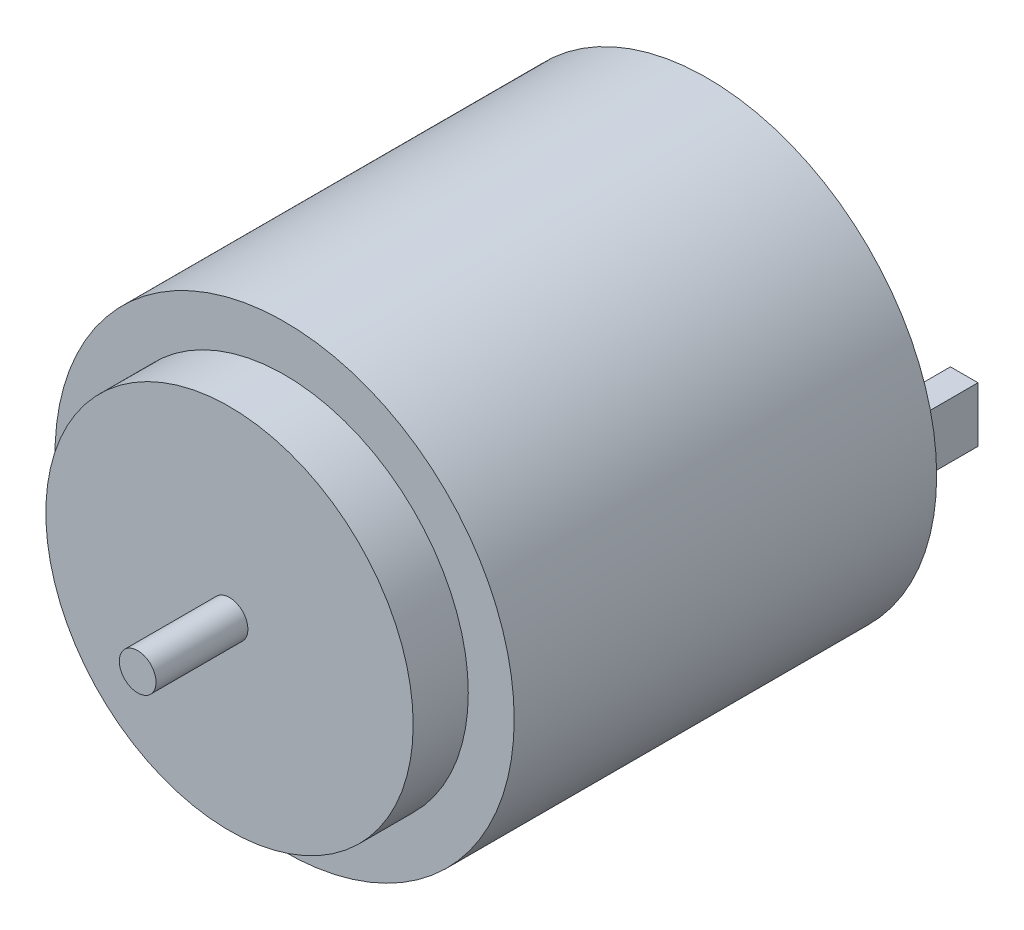
ISO-10303-21;
HEADER;
FILE_DESCRIPTION(('STEP AP214'),'2;1');
FILE_NAME('part.step','',(''),(''),'','','');
FILE_SCHEMA(('AUTOMOTIVE_DESIGN { 1 0 10303 214 1 1 1 1 }'));
ENDSEC;
DATA;
#1=APPLICATION_CONTEXT('core data for automotive mechanical design processes');
#2=APPLICATION_PROTOCOL_DEFINITION('international standard','automotive_design',2000,#1);
#3=PRODUCT_CONTEXT('',#1,'mechanical');
#4=PRODUCT('Part','Part','',(#3));
#5=PRODUCT_RELATED_PRODUCT_CATEGORY('part','',(#4));
#6=PRODUCT_DEFINITION_FORMATION('','',#4);
#7=PRODUCT_DEFINITION_CONTEXT('part definition',#1,'design');
#8=PRODUCT_DEFINITION('design','',#6,#7);
#9=PRODUCT_DEFINITION_SHAPE('','',#8);
#10=(LENGTH_UNIT() NAMED_UNIT(*) SI_UNIT(.MILLI.,.METRE.));
#11=(NAMED_UNIT(*) PLANE_ANGLE_UNIT() SI_UNIT($,.RADIAN.));
#12=(NAMED_UNIT(*) SI_UNIT($,.STERADIAN.) SOLID_ANGLE_UNIT());
#13=UNCERTAINTY_MEASURE_WITH_UNIT(LENGTH_MEASURE(1.E-05),#10,'distance_accuracy_value','');
#14=(GEOMETRIC_REPRESENTATION_CONTEXT(3) GLOBAL_UNCERTAINTY_ASSIGNED_CONTEXT((#13)) GLOBAL_UNIT_ASSIGNED_CONTEXT((#10,
#11,#12)) REPRESENTATION_CONTEXT('',''));
#15=CARTESIAN_POINT('',(0.,0.,0.));
#16=DIRECTION('',(0.,0.,1.));
#17=DIRECTION('',(1.,0.,0.));
#18=AXIS2_PLACEMENT_3D('',#15,#16,#17);
#19=CARTESIAN_POINT('',(-60.7801317233809,28.5357142857143,0.));
#20=DIRECTION('',(0.,0.,1.));
#21=DIRECTION('',(1.,0.,0.));
#22=AXIS2_PLACEMENT_3D('',#19,#20,#21);
#23=PLANE('',#22);
#24=DIRECTION('',(0.,1.,0.));
#25=VECTOR('',#24,1.);
#26=CARTESIAN_POINT('',(-51.5301317233809,27.0357142857143,0.));
#27=LINE('',#26,#25);
#28=CARTESIAN_POINT('',(-51.5301317233809,27.0357142857143,0.));
#29=VERTEX_POINT('',#28);
#30=CARTESIAN_POINT('',(-51.5301317233809,30.0357142857143,0.));
#31=VERTEX_POINT('',#30);
#32=EDGE_CURVE('E122',#29,#31,#27,.T.);
#33=ORIENTED_EDGE('',*,*,#32,.F.);
#34=DIRECTION('',(-1.,0.,0.));
#35=VECTOR('',#34,1.);
#36=CARTESIAN_POINT('',(-50.0301317233809,27.0357142857143,0.));
#37=LINE('',#36,#35);
#38=CARTESIAN_POINT('',(-50.0301317233809,27.0357142857143,0.));
#39=VERTEX_POINT('',#38);
#40=EDGE_CURVE('E135',#39,#29,#37,.T.);
#41=ORIENTED_EDGE('',*,*,#40,.F.);
#42=DIRECTION('',(0.,-1.,0.));
#43=VECTOR('',#42,1.);
#44=CARTESIAN_POINT('',(-50.0301317233809,27.0357142857143,0.));
#45=LINE('',#44,#43);
#46=CARTESIAN_POINT('',(-50.0301317233809,30.0357142857143,0.));
#47=VERTEX_POINT('',#46);
#48=EDGE_CURVE('E144',#47,#39,#45,.T.);
#49=ORIENTED_EDGE('',*,*,#48,.F.);
#50=DIRECTION('',(1.,0.,0.));
#51=VECTOR('',#50,1.);
#52=CARTESIAN_POINT('',(-50.0301317233809,30.0357142857143,0.));
#53=LINE('',#52,#51);
#54=EDGE_CURVE('E125',#31,#47,#53,.T.);
#55=ORIENTED_EDGE('',*,*,#54,.F.);
#56=EDGE_LOOP('',(#33,#41,#49,#55));
#57=FACE_BOUND('',#56,.T.);
#58=CARTESIAN_POINT('',(-60.7801317233809,28.5357142857143,0.));
#59=DIRECTION('',(0.,0.,1.));
#60=DIRECTION('',(1.,0.,0.));
#61=AXIS2_PLACEMENT_3D('',#58,#59,#60);
#62=CIRCLE('',#61,12.5);
#63=CARTESIAN_POINT('',(-48.2801317233809,28.5357142857143,0.));
#64=VERTEX_POINT('',#63);
#65=EDGE_CURVE('E38',#64,#64,#62,.T.);
#66=ORIENTED_EDGE('',*,*,#65,.F.);
#67=EDGE_LOOP('',(#66));
#68=FACE_BOUND('',#67,.T.);
#69=DIRECTION('',(-1.,0.,0.));
#70=VECTOR('',#69,1.);
#71=CARTESIAN_POINT('',(-71.5301317233809,27.0357142857143,0.));
#72=LINE('',#71,#70);
#73=CARTESIAN_POINT('',(-70.0301317233809,27.0357142857143,0.));
#74=VERTEX_POINT('',#73);
#75=CARTESIAN_POINT('',(-71.5301317233809,27.0357142857143,0.));
#76=VERTEX_POINT('',#75);
#77=EDGE_CURVE('E121',#74,#76,#72,.T.);
#78=ORIENTED_EDGE('',*,*,#77,.F.);
#79=DIRECTION('',(0.,-1.,0.));
#80=VECTOR('',#79,1.);
#81=CARTESIAN_POINT('',(-70.0301317233809,27.0357142857143,0.));
#82=LINE('',#81,#80);
#83=CARTESIAN_POINT('',(-70.0301317233809,30.0357142857143,0.));
#84=VERTEX_POINT('',#83);
#85=EDGE_CURVE('E118',#84,#74,#82,.T.);
#86=ORIENTED_EDGE('',*,*,#85,.F.);
#87=DIRECTION('',(1.,0.,0.));
#88=VECTOR('',#87,1.);
#89=CARTESIAN_POINT('',(-71.5301317233809,30.0357142857143,0.));
#90=LINE('',#89,#88);
#91=CARTESIAN_POINT('',(-71.5301317233809,30.0357142857143,0.));
#92=VERTEX_POINT('',#91);
#93=EDGE_CURVE('E56',#92,#84,#90,.T.);
#94=ORIENTED_EDGE('',*,*,#93,.F.);
#95=DIRECTION('',(0.,1.,0.));
#96=VECTOR('',#95,1.);
#97=CARTESIAN_POINT('',(-71.5301317233809,27.0357142857143,0.));
#98=LINE('',#97,#96);
#99=EDGE_CURVE('E51',#76,#92,#98,.T.);
#100=ORIENTED_EDGE('',*,*,#99,.F.);
#101=EDGE_LOOP('',(#78,#86,#94,#100));
#102=FACE_BOUND('',#101,.T.);
#103=ADVANCED_FACE('F34',(#57,#68,#102),#23,.F.);
#104=CARTESIAN_POINT('',(-60.7801317233809,28.5357142857143,23.));
#105=DIRECTION('',(0.,0.,-1.));
#106=DIRECTION('',(-1.,0.,0.));
#107=AXIS2_PLACEMENT_3D('',#104,#105,#106);
#108=CYLINDRICAL_SURFACE('',#107,12.5);
#109=CARTESIAN_POINT('',(-60.7801317233809,28.5357142857143,23.));
#110=DIRECTION('',(0.,0.,1.));
#111=DIRECTION('',(1.,0.,0.));
#112=AXIS2_PLACEMENT_3D('',#109,#110,#111);
#113=CIRCLE('',#112,12.5);
#114=CARTESIAN_POINT('',(-48.2801317233809,28.5357142857143,23.));
#115=VERTEX_POINT('',#114);
#116=EDGE_CURVE('E43',#115,#115,#113,.T.);
#117=ORIENTED_EDGE('',*,*,#116,.F.);
#118=EDGE_LOOP('',(#117));
#119=FACE_BOUND('',#118,.T.);
#120=ORIENTED_EDGE('',*,*,#65,.T.);
#121=EDGE_LOOP('',(#120));
#122=FACE_BOUND('',#121,.T.);
#123=ADVANCED_FACE('F36',(#119,#122),#108,.T.);
#124=CARTESIAN_POINT('',(-60.7801317233809,28.5357142857143,23.));
#125=DIRECTION('',(0.,0.,1.));
#126=DIRECTION('',(1.,0.,0.));
#127=AXIS2_PLACEMENT_3D('',#124,#125,#126);
#128=PLANE('',#127);
#129=CARTESIAN_POINT('',(-60.7801317233809,28.5357142857143,23.));
#130=DIRECTION('',(0.,0.,1.));
#131=DIRECTION('',(1.,0.,0.));
#132=AXIS2_PLACEMENT_3D('',#129,#130,#131);
#133=CIRCLE('',#132,10.);
#134=CARTESIAN_POINT('',(-50.7801317233809,28.5357142857143,23.));
#135=VERTEX_POINT('',#134);
#136=EDGE_CURVE('E11',#135,#135,#133,.T.);
#137=ORIENTED_EDGE('',*,*,#136,.F.);
#138=EDGE_LOOP('',(#137));
#139=FACE_BOUND('',#138,.T.);
#140=ORIENTED_EDGE('',*,*,#116,.T.);
#141=EDGE_LOOP('',(#140));
#142=FACE_BOUND('',#141,.T.);
#143=ADVANCED_FACE('F239',(#139,#142),#128,.T.);
#144=CARTESIAN_POINT('',(-60.7801317233809,28.5357142857143,26.));
#145=DIRECTION('',(0.,0.,-1.));
#146=DIRECTION('',(-1.,0.,0.));
#147=AXIS2_PLACEMENT_3D('',#144,#145,#146);
#148=CYLINDRICAL_SURFACE('',#147,10.);
#149=CARTESIAN_POINT('',(-60.7801317233809,28.5357142857143,26.));
#150=DIRECTION('',(0.,0.,1.));
#151=DIRECTION('',(1.,0.,0.));
#152=AXIS2_PLACEMENT_3D('',#149,#150,#151);
#153=CIRCLE('',#152,10.);
#154=CARTESIAN_POINT('',(-50.7801317233809,28.5357142857143,26.));
#155=VERTEX_POINT('',#154);
#156=EDGE_CURVE('E164',#155,#155,#153,.T.);
#157=ORIENTED_EDGE('',*,*,#156,.F.);
#158=EDGE_LOOP('',(#157));
#159=FACE_BOUND('',#158,.T.);
#160=ORIENTED_EDGE('',*,*,#136,.T.);
#161=EDGE_LOOP('',(#160));
#162=FACE_BOUND('',#161,.T.);
#163=ADVANCED_FACE('F235',(#159,#162),#148,.T.);
#164=CARTESIAN_POINT('',(-60.7801317233809,28.5357142857143,26.));
#165=DIRECTION('',(0.,0.,1.));
#166=DIRECTION('',(1.,0.,0.));
#167=AXIS2_PLACEMENT_3D('',#164,#165,#166);
#168=PLANE('',#167);
#169=CARTESIAN_POINT('',(-60.7801317233809,28.5357142857143,26.));
#170=DIRECTION('',(0.,0.,1.));
#171=DIRECTION('',(1.,0.,0.));
#172=AXIS2_PLACEMENT_3D('',#169,#170,#171);
#173=CIRCLE('',#172,0.999999999999998);
#174=CARTESIAN_POINT('',(-59.7801317233809,28.5357142857143,26.));
#175=VERTEX_POINT('',#174);
#176=EDGE_CURVE('E160',#175,#175,#173,.T.);
#177=ORIENTED_EDGE('',*,*,#176,.F.);
#178=EDGE_LOOP('',(#177));
#179=FACE_BOUND('',#178,.T.);
#180=ORIENTED_EDGE('',*,*,#156,.T.);
#181=EDGE_LOOP('',(#180));
#182=FACE_BOUND('',#181,.T.);
#183=ADVANCED_FACE('F231',(#179,#182),#168,.T.);
#184=CARTESIAN_POINT('',(-60.7801317233809,28.5357142857143,31.));
#185=DIRECTION('',(0.,0.,-1.));
#186=DIRECTION('',(-1.,0.,0.));
#187=AXIS2_PLACEMENT_3D('',#184,#185,#186);
#188=CYLINDRICAL_SURFACE('',#187,0.999999999999998);
#189=CARTESIAN_POINT('',(-60.7801317233809,28.5357142857143,31.));
#190=DIRECTION('',(0.,0.,1.));
#191=DIRECTION('',(1.,0.,0.));
#192=AXIS2_PLACEMENT_3D('',#189,#190,#191);
#193=CIRCLE('',#192,0.999999999999998);
#194=CARTESIAN_POINT('',(-59.7801317233809,28.5357142857143,31.));
#195=VERTEX_POINT('',#194);
#196=EDGE_CURVE('E161',#195,#195,#193,.T.);
#197=ORIENTED_EDGE('',*,*,#196,.F.);
#198=EDGE_LOOP('',(#197));
#199=FACE_BOUND('',#198,.T.);
#200=ORIENTED_EDGE('',*,*,#176,.T.);
#201=EDGE_LOOP('',(#200));
#202=FACE_BOUND('',#201,.T.);
#203=ADVANCED_FACE('F227',(#199,#202),#188,.T.);
#204=CARTESIAN_POINT('',(-60.7801317233809,28.5357142857143,31.));
#205=DIRECTION('',(0.,0.,1.));
#206=DIRECTION('',(1.,0.,0.));
#207=AXIS2_PLACEMENT_3D('',#204,#205,#206);
#208=PLANE('',#207);
#209=ORIENTED_EDGE('',*,*,#196,.T.);
#210=EDGE_LOOP('',(#209));
#211=FACE_BOUND('',#210,.T.);
#212=ADVANCED_FACE('F223',(#211),#208,.T.);
#213=CARTESIAN_POINT('',(-51.5301317233809,27.0357142857143,-4.));
#214=DIRECTION('',(1.,0.,0.));
#215=DIRECTION('',(0.,0.,-1.));
#216=AXIS2_PLACEMENT_3D('',#213,#214,#215);
#217=PLANE('',#216);
#218=ORIENTED_EDGE('',*,*,#32,.T.);
#219=DIRECTION('',(0.,0.,1.));
#220=VECTOR('',#219,1.);
#221=CARTESIAN_POINT('',(-51.5301317233809,30.0357142857143,-4.));
#222=LINE('',#221,#220);
#223=CARTESIAN_POINT('',(-51.5301317233809,30.0357142857143,-4.));
#224=VERTEX_POINT('',#223);
#225=EDGE_CURVE('E157',#224,#31,#222,.T.);
#226=ORIENTED_EDGE('',*,*,#225,.F.);
#227=DIRECTION('',(0.,1.,0.));
#228=VECTOR('',#227,1.);
#229=CARTESIAN_POINT('',(-51.5301317233809,27.0357142857143,-4.));
#230=LINE('',#229,#228);
#231=CARTESIAN_POINT('',(-51.5301317233809,27.0357142857143,-4.));
#232=VERTEX_POINT('',#231);
#233=EDGE_CURVE('E131',#232,#224,#230,.T.);
#234=ORIENTED_EDGE('',*,*,#233,.F.);
#235=DIRECTION('',(0.,0.,1.));
#236=VECTOR('',#235,1.);
#237=CARTESIAN_POINT('',(-51.5301317233809,27.0357142857143,-4.));
#238=LINE('',#237,#236);
#239=EDGE_CURVE('E140',#232,#29,#238,.T.);
#240=ORIENTED_EDGE('',*,*,#239,.T.);
#241=EDGE_LOOP('',(#218,#226,#234,#240));
#242=FACE_BOUND('',#241,.T.);
#243=ADVANCED_FACE('F219',(#242),#217,.F.);
#244=CARTESIAN_POINT('',(-50.0301317233809,30.0357142857143,-4.));
#245=DIRECTION('',(0.,-1.,0.));
#246=DIRECTION('',(0.,0.,-1.));
#247=AXIS2_PLACEMENT_3D('',#244,#245,#246);
#248=PLANE('',#247);
#249=ORIENTED_EDGE('',*,*,#54,.T.);
#250=DIRECTION('',(0.,0.,1.));
#251=VECTOR('',#250,1.);
#252=CARTESIAN_POINT('',(-50.0301317233809,30.0357142857143,-4.));
#253=LINE('',#252,#251);
#254=CARTESIAN_POINT('',(-50.0301317233809,30.0357142857143,-4.));
#255=VERTEX_POINT('',#254);
#256=EDGE_CURVE('E154',#255,#47,#253,.T.);
#257=ORIENTED_EDGE('',*,*,#256,.F.);
#258=DIRECTION('',(1.,0.,0.));
#259=VECTOR('',#258,1.);
#260=CARTESIAN_POINT('',(-50.0301317233809,30.0357142857143,-4.));
#261=LINE('',#260,#259);
#262=EDGE_CURVE('E134',#224,#255,#261,.T.);
#263=ORIENTED_EDGE('',*,*,#262,.F.);
#264=ORIENTED_EDGE('',*,*,#225,.T.);
#265=EDGE_LOOP('',(#249,#257,#263,#264));
#266=FACE_BOUND('',#265,.T.);
#267=ADVANCED_FACE('F215',(#266),#248,.F.);
#268=CARTESIAN_POINT('',(-50.0301317233809,27.0357142857143,-4.));
#269=DIRECTION('',(-1.,0.,0.));
#270=DIRECTION('',(0.,0.,1.));
#271=AXIS2_PLACEMENT_3D('',#268,#269,#270);
#272=PLANE('',#271);
#273=ORIENTED_EDGE('',*,*,#48,.T.);
#274=DIRECTION('',(0.,0.,1.));
#275=VECTOR('',#274,1.);
#276=CARTESIAN_POINT('',(-50.0301317233809,27.0357142857143,-4.));
#277=LINE('',#276,#275);
#278=CARTESIAN_POINT('',(-50.0301317233809,27.0357142857143,-4.));
#279=VERTEX_POINT('',#278);
#280=EDGE_CURVE('E151',#279,#39,#277,.T.);
#281=ORIENTED_EDGE('',*,*,#280,.F.);
#282=DIRECTION('',(0.,-1.,0.));
#283=VECTOR('',#282,1.);
#284=CARTESIAN_POINT('',(-50.0301317233809,27.0357142857143,-4.));
#285=LINE('',#284,#283);
#286=EDGE_CURVE('E137',#255,#279,#285,.T.);
#287=ORIENTED_EDGE('',*,*,#286,.F.);
#288=ORIENTED_EDGE('',*,*,#256,.T.);
#289=EDGE_LOOP('',(#273,#281,#287,#288));
#290=FACE_BOUND('',#289,.T.);
#291=ADVANCED_FACE('F211',(#290),#272,.F.);
#292=CARTESIAN_POINT('',(-50.0301317233809,27.0357142857143,-4.));
#293=DIRECTION('',(0.,1.,0.));
#294=DIRECTION('',(0.,0.,1.));
#295=AXIS2_PLACEMENT_3D('',#292,#293,#294);
#296=PLANE('',#295);
#297=ORIENTED_EDGE('',*,*,#40,.T.);
#298=ORIENTED_EDGE('',*,*,#239,.F.);
#299=DIRECTION('',(-1.,0.,0.));
#300=VECTOR('',#299,1.);
#301=CARTESIAN_POINT('',(-50.0301317233809,27.0357142857143,-4.));
#302=LINE('',#301,#300);
#303=EDGE_CURVE('E139',#279,#232,#302,.T.);
#304=ORIENTED_EDGE('',*,*,#303,.F.);
#305=ORIENTED_EDGE('',*,*,#280,.T.);
#306=EDGE_LOOP('',(#297,#298,#304,#305));
#307=FACE_BOUND('',#306,.T.);
#308=ADVANCED_FACE('F207',(#307),#296,.F.);
#309=CARTESIAN_POINT('',(0.,0.,-4.));
#310=DIRECTION('',(0.,0.,1.));
#311=DIRECTION('',(1.,0.,0.));
#312=AXIS2_PLACEMENT_3D('',#309,#310,#311);
#313=PLANE('',#312);
#314=ORIENTED_EDGE('',*,*,#233,.T.);
#315=ORIENTED_EDGE('',*,*,#262,.T.);
#316=ORIENTED_EDGE('',*,*,#286,.T.);
#317=ORIENTED_EDGE('',*,*,#303,.T.);
#318=EDGE_LOOP('',(#314,#315,#316,#317));
#319=FACE_BOUND('',#318,.T.);
#320=ADVANCED_FACE('F204',(#319),#313,.F.);
#321=CARTESIAN_POINT('',(-71.5301317233809,27.0357142857143,-4.));
#322=DIRECTION('',(0.,1.,0.));
#323=DIRECTION('',(0.,0.,1.));
#324=AXIS2_PLACEMENT_3D('',#321,#322,#323);
#325=PLANE('',#324);
#326=ORIENTED_EDGE('',*,*,#77,.T.);
#327=DIRECTION('',(0.,0.,1.));
#328=VECTOR('',#327,1.);
#329=CARTESIAN_POINT('',(-71.5301317233809,27.0357142857143,-4.));
#330=LINE('',#329,#328);
#331=CARTESIAN_POINT('',(-71.5301317233809,27.0357142857143,-4.));
#332=VERTEX_POINT('',#331);
#333=EDGE_CURVE('E102',#332,#76,#330,.T.);
#334=ORIENTED_EDGE('',*,*,#333,.F.);
#335=DIRECTION('',(-1.,0.,0.));
#336=VECTOR('',#335,1.);
#337=CARTESIAN_POINT('',(-71.5301317233809,27.0357142857143,-4.));
#338=LINE('',#337,#336);
#339=CARTESIAN_POINT('',(-70.0301317233809,27.0357142857143,-4.));
#340=VERTEX_POINT('',#339);
#341=EDGE_CURVE('E109',#340,#332,#338,.T.);
#342=ORIENTED_EDGE('',*,*,#341,.F.);
#343=DIRECTION('',(0.,0.,1.));
#344=VECTOR('',#343,1.);
#345=CARTESIAN_POINT('',(-70.0301317233809,27.0357142857143,-4.));
#346=LINE('',#345,#344);
#347=EDGE_CURVE('E182',#340,#74,#346,.T.);
#348=ORIENTED_EDGE('',*,*,#347,.T.);
#349=EDGE_LOOP('',(#326,#334,#342,#348));
#350=FACE_BOUND('',#349,.T.);
#351=ADVANCED_FACE('F120',(#350),#325,.F.);
#352=CARTESIAN_POINT('',(-71.5301317233809,27.0357142857143,-4.));
#353=DIRECTION('',(1.,0.,0.));
#354=DIRECTION('',(0.,0.,-1.));
#355=AXIS2_PLACEMENT_3D('',#352,#353,#354);
#356=PLANE('',#355);
#357=ORIENTED_EDGE('',*,*,#99,.T.);
#358=DIRECTION('',(0.,0.,1.));
#359=VECTOR('',#358,1.);
#360=CARTESIAN_POINT('',(-71.5301317233809,30.0357142857143,-4.));
#361=LINE('',#360,#359);
#362=CARTESIAN_POINT('',(-71.5301317233809,30.0357142857143,-4.));
#363=VERTEX_POINT('',#362);
#364=EDGE_CURVE('E105',#363,#92,#361,.T.);
#365=ORIENTED_EDGE('',*,*,#364,.F.);
#366=DIRECTION('',(0.,1.,0.));
#367=VECTOR('',#366,1.);
#368=CARTESIAN_POINT('',(-71.5301317233809,27.0357142857143,-4.));
#369=LINE('',#368,#367);
#370=EDGE_CURVE('E98',#332,#363,#369,.T.);
#371=ORIENTED_EDGE('',*,*,#370,.F.);
#372=ORIENTED_EDGE('',*,*,#333,.T.);
#373=EDGE_LOOP('',(#357,#365,#371,#372));
#374=FACE_BOUND('',#373,.T.);
#375=ADVANCED_FACE('F100',(#374),#356,.F.);
#376=CARTESIAN_POINT('',(-71.5301317233809,30.0357142857143,-4.));
#377=DIRECTION('',(0.,-1.,0.));
#378=DIRECTION('',(0.,0.,-1.));
#379=AXIS2_PLACEMENT_3D('',#376,#377,#378);
#380=PLANE('',#379);
#381=ORIENTED_EDGE('',*,*,#93,.T.);
#382=DIRECTION('',(0.,0.,1.));
#383=VECTOR('',#382,1.);
#384=CARTESIAN_POINT('',(-70.0301317233809,30.0357142857143,-4.));
#385=LINE('',#384,#383);
#386=CARTESIAN_POINT('',(-70.0301317233809,30.0357142857143,-4.));
#387=VERTEX_POINT('',#386);
#388=EDGE_CURVE('E127',#387,#84,#385,.T.);
#389=ORIENTED_EDGE('',*,*,#388,.F.);
#390=DIRECTION('',(1.,0.,0.));
#391=VECTOR('',#390,1.);
#392=CARTESIAN_POINT('',(-71.5301317233809,30.0357142857143,-4.));
#393=LINE('',#392,#391);
#394=EDGE_CURVE('E108',#363,#387,#393,.T.);
#395=ORIENTED_EDGE('',*,*,#394,.F.);
#396=ORIENTED_EDGE('',*,*,#364,.T.);
#397=EDGE_LOOP('',(#381,#389,#395,#396));
#398=FACE_BOUND('',#397,.T.);
#399=ADVANCED_FACE('F191',(#398),#380,.F.);
#400=CARTESIAN_POINT('',(-70.0301317233809,27.0357142857143,-4.));
#401=DIRECTION('',(-1.,0.,0.));
#402=DIRECTION('',(0.,0.,1.));
#403=AXIS2_PLACEMENT_3D('',#400,#401,#402);
#404=PLANE('',#403);
#405=ORIENTED_EDGE('',*,*,#85,.T.);
#406=ORIENTED_EDGE('',*,*,#347,.F.);
#407=DIRECTION('',(0.,-1.,0.));
#408=VECTOR('',#407,1.);
#409=CARTESIAN_POINT('',(-70.0301317233809,27.0357142857143,-4.));
#410=LINE('',#409,#408);
#411=EDGE_CURVE('E114',#387,#340,#410,.T.);
#412=ORIENTED_EDGE('',*,*,#411,.F.);
#413=ORIENTED_EDGE('',*,*,#388,.T.);
#414=EDGE_LOOP('',(#405,#406,#412,#413));
#415=FACE_BOUND('',#414,.T.);
#416=ADVANCED_FACE('F181',(#415),#404,.F.);
#417=CARTESIAN_POINT('',(0.,0.,-4.));
#418=DIRECTION('',(0.,0.,1.));
#419=DIRECTION('',(1.,0.,0.));
#420=AXIS2_PLACEMENT_3D('',#417,#418,#419);
#421=PLANE('',#420);
#422=ORIENTED_EDGE('',*,*,#341,.T.);
#423=ORIENTED_EDGE('',*,*,#370,.T.);
#424=ORIENTED_EDGE('',*,*,#394,.T.);
#425=ORIENTED_EDGE('',*,*,#411,.T.);
#426=EDGE_LOOP('',(#422,#423,#424,#425));
#427=FACE_BOUND('',#426,.T.);
#428=ADVANCED_FACE('F112',(#427),#421,.F.);
#429=CLOSED_SHELL('',(#103,#123,#143,#163,#183,#203,#212,#243,#267,#291,#308,#320,#351,#375,
#399,#416,#428));
#430=MANIFOLD_SOLID_BREP('B2',#429);
#431=ADVANCED_BREP_SHAPE_REPRESENTATION('',(#18,#430),#14);
#432=SHAPE_DEFINITION_REPRESENTATION(#9,#431);
ENDSEC;
END-ISO-10303-21;
